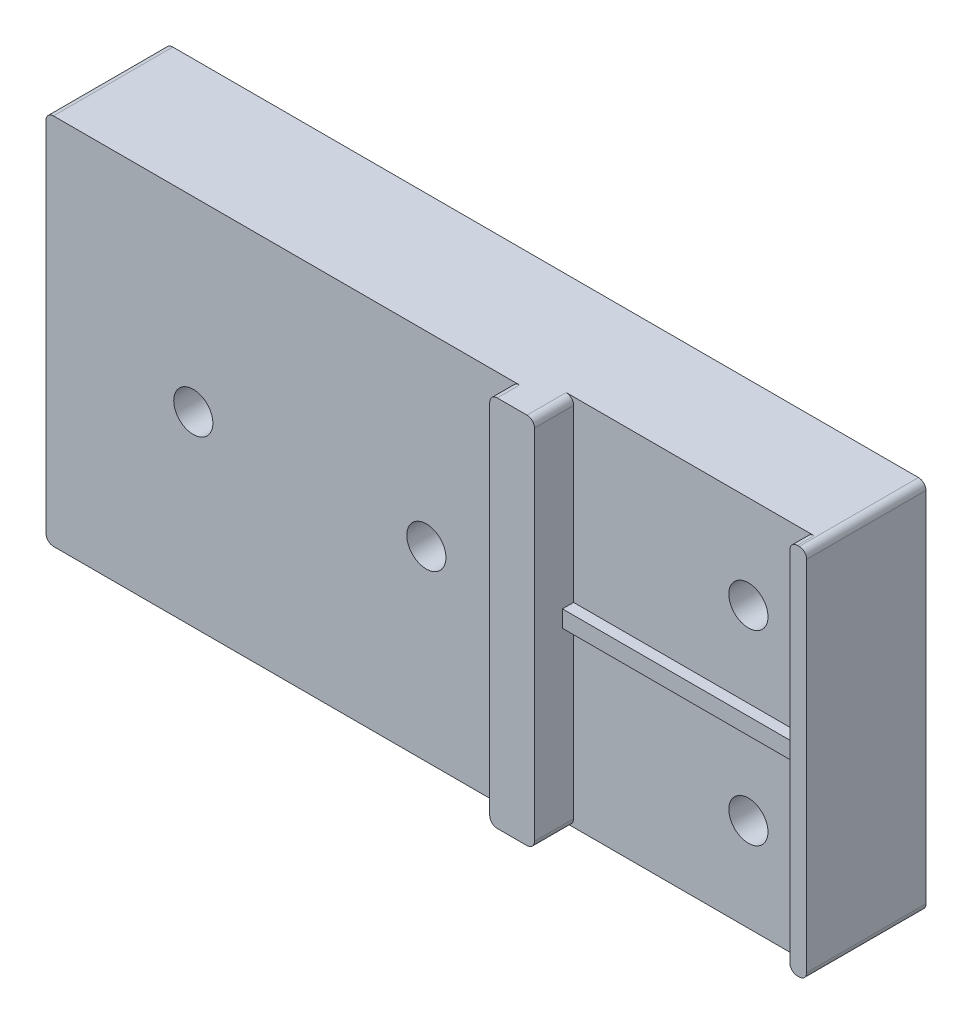
ISO-10303-21;
HEADER;
FILE_DESCRIPTION(('STEP AP214'),'2;1');
FILE_NAME('part.step','',(''),(''),'','','');
FILE_SCHEMA(('AUTOMOTIVE_DESIGN { 1 0 10303 214 1 1 1 1 }'));
ENDSEC;
DATA;
#1=APPLICATION_CONTEXT('core data for automotive mechanical design processes');
#2=APPLICATION_PROTOCOL_DEFINITION('international standard','automotive_design',2000,#1);
#3=PRODUCT_CONTEXT('',#1,'mechanical');
#4=PRODUCT('Part','Part','',(#3));
#5=PRODUCT_RELATED_PRODUCT_CATEGORY('part','',(#4));
#6=PRODUCT_DEFINITION_FORMATION('','',#4);
#7=PRODUCT_DEFINITION_CONTEXT('part definition',#1,'design');
#8=PRODUCT_DEFINITION('design','',#6,#7);
#9=PRODUCT_DEFINITION_SHAPE('','',#8);
#10=(LENGTH_UNIT() NAMED_UNIT(*) SI_UNIT(.MILLI.,.METRE.));
#11=(NAMED_UNIT(*) PLANE_ANGLE_UNIT() SI_UNIT($,.RADIAN.));
#12=(NAMED_UNIT(*) SI_UNIT($,.STERADIAN.) SOLID_ANGLE_UNIT());
#13=UNCERTAINTY_MEASURE_WITH_UNIT(LENGTH_MEASURE(1.E-05),#10,'distance_accuracy_value','');
#14=(GEOMETRIC_REPRESENTATION_CONTEXT(3) GLOBAL_UNCERTAINTY_ASSIGNED_CONTEXT((#13)) GLOBAL_UNIT_ASSIGNED_CONTEXT((#10,
#11,#12)) REPRESENTATION_CONTEXT('',''));
#15=CARTESIAN_POINT('',(0.,0.,0.));
#16=DIRECTION('',(0.,0.,1.));
#17=DIRECTION('',(1.,0.,0.));
#18=AXIS2_PLACEMENT_3D('',#15,#16,#17);
#19=CARTESIAN_POINT('',(14.,-40.,15.2));
#20=DIRECTION('',(-1.,0.,0.));
#21=DIRECTION('',(0.,0.,1.));
#22=AXIS2_PLACEMENT_3D('',#19,#20,#21);
#23=PLANE('',#22);
#24=DIRECTION('',(0.,1.,0.));
#25=VECTOR('',#24,1.);
#26=CARTESIAN_POINT('',(14.,-40.,15.2));
#27=LINE('',#26,#25);
#28=CARTESIAN_POINT('',(14.,-39.2,15.2));
#29=VERTEX_POINT('',#28);
#30=CARTESIAN_POINT('',(14.,-0.800000000000002,15.2));
#31=VERTEX_POINT('',#30);
#32=EDGE_CURVE('E314',#29,#31,#27,.T.);
#33=ORIENTED_EDGE('',*,*,#32,.F.);
#34=DIRECTION('',(0.,0.,1.));
#35=VECTOR('',#34,1.);
#36=CARTESIAN_POINT('',(14.,-39.2,11.));
#37=LINE('',#36,#35);
#38=CARTESIAN_POINT('',(14.,-39.2,11.));
#39=VERTEX_POINT('',#38);
#40=EDGE_CURVE('E373',#29,#39,#37,.F.);
#41=ORIENTED_EDGE('',*,*,#40,.T.);
#42=DIRECTION('',(0.,1.,0.));
#43=VECTOR('',#42,1.);
#44=CARTESIAN_POINT('',(14.,-40.,11.));
#45=LINE('',#44,#43);
#46=CARTESIAN_POINT('',(14.,-20.9,11.));
#47=VERTEX_POINT('',#46);
#48=EDGE_CURVE('E294',#39,#47,#45,.T.);
#49=ORIENTED_EDGE('',*,*,#48,.T.);
#50=DIRECTION('',(0.,0.,-1.));
#51=VECTOR('',#50,1.);
#52=CARTESIAN_POINT('',(14.,-20.9,12.2));
#53=LINE('',#52,#51);
#54=CARTESIAN_POINT('',(14.,-20.9,12.2));
#55=VERTEX_POINT('',#54);
#56=EDGE_CURVE('E218',#55,#47,#53,.T.);
#57=ORIENTED_EDGE('',*,*,#56,.F.);
#58=DIRECTION('',(0.,-1.,0.));
#59=VECTOR('',#58,1.);
#60=CARTESIAN_POINT('',(14.,-19.1,12.2));
#61=LINE('',#60,#59);
#62=CARTESIAN_POINT('',(14.,-19.1,12.2));
#63=VERTEX_POINT('',#62);
#64=EDGE_CURVE('E829',#63,#55,#61,.T.);
#65=ORIENTED_EDGE('',*,*,#64,.F.);
#66=DIRECTION('',(0.,0.,-1.));
#67=VECTOR('',#66,1.);
#68=CARTESIAN_POINT('',(14.,-19.1,12.2));
#69=LINE('',#68,#67);
#70=CARTESIAN_POINT('',(14.,-19.1,11.));
#71=VERTEX_POINT('',#70);
#72=EDGE_CURVE('E231',#63,#71,#69,.T.);
#73=ORIENTED_EDGE('',*,*,#72,.T.);
#74=CARTESIAN_POINT('',(14.,-0.800000000000002,11.));
#75=VERTEX_POINT('',#74);
#76=EDGE_CURVE('E282',#71,#75,#45,.T.);
#77=ORIENTED_EDGE('',*,*,#76,.T.);
#78=DIRECTION('',(0.,0.,1.));
#79=VECTOR('',#78,1.);
#80=CARTESIAN_POINT('',(14.,-0.800000000000002,15.2));
#81=LINE('',#80,#79);
#82=EDGE_CURVE('E370',#75,#31,#81,.T.);
#83=ORIENTED_EDGE('',*,*,#82,.T.);
#84=EDGE_LOOP('',(#33,#41,#49,#57,#65,#73,#77,#83));
#85=FACE_BOUND('',#84,.T.);
#86=ADVANCED_FACE('F33',(#85),#23,.F.);
#87=CARTESIAN_POINT('',(39.,-40.,11.));
#88=DIRECTION('',(1.,0.,0.));
#89=DIRECTION('',(0.,0.,-1.));
#90=AXIS2_PLACEMENT_3D('',#87,#88,#89);
#91=PLANE('',#90);
#92=DIRECTION('',(0.,1.,0.));
#93=VECTOR('',#92,1.);
#94=CARTESIAN_POINT('',(39.,-40.,12.8));
#95=LINE('',#94,#93);
#96=CARTESIAN_POINT('',(39.,-39.2,12.8));
#97=VERTEX_POINT('',#96);
#98=CARTESIAN_POINT('',(39.,-0.800000000000002,12.8));
#99=VERTEX_POINT('',#98);
#100=EDGE_CURVE('E206',#97,#99,#95,.T.);
#101=ORIENTED_EDGE('',*,*,#100,.T.);
#102=DIRECTION('',(0.,0.,-1.));
#103=VECTOR('',#102,1.);
#104=CARTESIAN_POINT('',(39.,-0.800000000000002,11.));
#105=LINE('',#104,#103);
#106=CARTESIAN_POINT('',(39.,-0.800000000000002,11.));
#107=VERTEX_POINT('',#106);
#108=EDGE_CURVE('E325',#99,#107,#105,.T.);
#109=ORIENTED_EDGE('',*,*,#108,.T.);
#110=DIRECTION('',(0.,1.,0.));
#111=VECTOR('',#110,1.);
#112=CARTESIAN_POINT('',(39.,-40.,11.));
#113=LINE('',#112,#111);
#114=CARTESIAN_POINT('',(39.,-19.1,11.));
#115=VERTEX_POINT('',#114);
#116=EDGE_CURVE('E207',#115,#107,#113,.T.);
#117=ORIENTED_EDGE('',*,*,#116,.F.);
#118=DIRECTION('',(0.,0.,-1.));
#119=VECTOR('',#118,1.);
#120=CARTESIAN_POINT('',(39.,-19.1,12.2));
#121=LINE('',#120,#119);
#122=CARTESIAN_POINT('',(39.,-19.1,12.2));
#123=VERTEX_POINT('',#122);
#124=EDGE_CURVE('E233',#123,#115,#121,.T.);
#125=ORIENTED_EDGE('',*,*,#124,.F.);
#126=DIRECTION('',(0.,1.,0.));
#127=VECTOR('',#126,1.);
#128=CARTESIAN_POINT('',(39.,-19.1,12.2));
#129=LINE('',#128,#127);
#130=CARTESIAN_POINT('',(39.,-20.9,12.2));
#131=VERTEX_POINT('',#130);
#132=EDGE_CURVE('E214',#131,#123,#129,.T.);
#133=ORIENTED_EDGE('',*,*,#132,.F.);
#134=DIRECTION('',(0.,0.,-1.));
#135=VECTOR('',#134,1.);
#136=CARTESIAN_POINT('',(39.,-20.9,12.2));
#137=LINE('',#136,#135);
#138=CARTESIAN_POINT('',(39.,-20.9,11.));
#139=VERTEX_POINT('',#138);
#140=EDGE_CURVE('E210',#131,#139,#137,.T.);
#141=ORIENTED_EDGE('',*,*,#140,.T.);
#142=CARTESIAN_POINT('',(39.,-39.2,11.));
#143=VERTEX_POINT('',#142);
#144=EDGE_CURVE('E195',#143,#139,#113,.T.);
#145=ORIENTED_EDGE('',*,*,#144,.F.);
#146=DIRECTION('',(0.,0.,-1.));
#147=VECTOR('',#146,1.);
#148=CARTESIAN_POINT('',(39.,-39.2,12.8));
#149=LINE('',#148,#147);
#150=EDGE_CURVE('E323',#143,#97,#149,.F.);
#151=ORIENTED_EDGE('',*,*,#150,.T.);
#152=EDGE_LOOP('',(#101,#109,#117,#125,#133,#141,#145,#151));
#153=FACE_BOUND('',#152,.T.);
#154=ADVANCED_FACE('F212',(#153),#91,.F.);
#155=CARTESIAN_POINT('',(14.,-40.,11.));
#156=DIRECTION('',(0.,0.,-1.));
#157=DIRECTION('',(-1.,0.,0.));
#158=AXIS2_PLACEMENT_3D('',#155,#156,#157);
#159=PLANE('',#158);
#160=CARTESIAN_POINT('',(32.75,-10.,11.));
#161=DIRECTION('',(0.,0.,1.));
#162=DIRECTION('',(1.,0.,0.));
#163=AXIS2_PLACEMENT_3D('',#160,#161,#162);
#164=CIRCLE('',#163,2.1);
#165=CARTESIAN_POINT('',(34.85,-10.,11.));
#166=VERTEX_POINT('',#165);
#167=EDGE_CURVE('E249',#166,#166,#164,.T.);
#168=ORIENTED_EDGE('',*,*,#167,.F.);
#169=EDGE_LOOP('',(#168));
#170=FACE_BOUND('',#169,.T.);
#171=DIRECTION('',(-1.,0.,0.));
#172=VECTOR('',#171,1.);
#173=CARTESIAN_POINT('',(14.,-19.1,11.));
#174=LINE('',#173,#172);
#175=EDGE_CURVE('E222',#115,#71,#174,.T.);
#176=ORIENTED_EDGE('',*,*,#175,.F.);
#177=ORIENTED_EDGE('',*,*,#116,.T.);
#178=CARTESIAN_POINT('',(39.8,-0.800000000000002,11.));
#179=DIRECTION('',(0.,0.,-1.));
#180=DIRECTION('',(-1.,0.,0.));
#181=AXIS2_PLACEMENT_3D('',#178,#179,#180);
#182=CIRCLE('',#181,0.8);
#183=CARTESIAN_POINT('',(39.8,0.,11.));
#184=VERTEX_POINT('',#183);
#185=EDGE_CURVE('E400',#107,#184,#182,.T.);
#186=ORIENTED_EDGE('',*,*,#185,.T.);
#187=DIRECTION('',(-1.,0.,0.));
#188=VECTOR('',#187,1.);
#189=CARTESIAN_POINT('',(14.,0.,11.));
#190=LINE('',#189,#188);
#191=CARTESIAN_POINT('',(13.2,0.,11.));
#192=VERTEX_POINT('',#191);
#193=EDGE_CURVE('E271',#184,#192,#190,.T.);
#194=ORIENTED_EDGE('',*,*,#193,.T.);
#195=CARTESIAN_POINT('',(13.2,-0.800000000000002,11.));
#196=DIRECTION('',(0.,0.,-1.));
#197=DIRECTION('',(-1.,0.,0.));
#198=AXIS2_PLACEMENT_3D('',#195,#196,#197);
#199=CIRCLE('',#198,0.8);
#200=EDGE_CURVE('E11',#192,#75,#199,.T.);
#201=ORIENTED_EDGE('',*,*,#200,.T.);
#202=ORIENTED_EDGE('',*,*,#76,.F.);
#203=EDGE_LOOP('',(#176,#177,#186,#194,#201,#202));
#204=FACE_BOUND('',#203,.T.);
#205=ADVANCED_FACE('F437',(#170,#204),#159,.F.);
#206=CARTESIAN_POINT('',(32.75,-30.,11.));
#207=DIRECTION('',(0.,0.,1.));
#208=DIRECTION('',(1.,0.,0.));
#209=AXIS2_PLACEMENT_3D('',#206,#207,#208);
#210=CIRCLE('',#209,2.1);
#211=CARTESIAN_POINT('',(34.85,-30.,11.));
#212=VERTEX_POINT('',#211);
#213=EDGE_CURVE('E240',#212,#212,#210,.T.);
#214=ORIENTED_EDGE('',*,*,#213,.F.);
#215=EDGE_LOOP('',(#214));
#216=FACE_BOUND('',#215,.T.);
#217=DIRECTION('',(1.,0.,0.));
#218=VECTOR('',#217,1.);
#219=CARTESIAN_POINT('',(14.,-20.9,11.));
#220=LINE('',#219,#218);
#221=EDGE_CURVE('E200',#47,#139,#220,.T.);
#222=ORIENTED_EDGE('',*,*,#221,.F.);
#223=ORIENTED_EDGE('',*,*,#48,.F.);
#224=CARTESIAN_POINT('',(13.2,-39.2,11.));
#225=DIRECTION('',(0.,0.,-1.));
#226=DIRECTION('',(-1.,0.,0.));
#227=AXIS2_PLACEMENT_3D('',#224,#225,#226);
#228=CIRCLE('',#227,0.8);
#229=CARTESIAN_POINT('',(13.2,-40.,11.));
#230=VERTEX_POINT('',#229);
#231=EDGE_CURVE('E404',#39,#230,#228,.T.);
#232=ORIENTED_EDGE('',*,*,#231,.T.);
#233=DIRECTION('',(-1.,0.,0.));
#234=VECTOR('',#233,1.);
#235=CARTESIAN_POINT('',(14.,-40.,11.));
#236=LINE('',#235,#234);
#237=CARTESIAN_POINT('',(39.8,-40.,11.));
#238=VERTEX_POINT('',#237);
#239=EDGE_CURVE('E280',#238,#230,#236,.T.);
#240=ORIENTED_EDGE('',*,*,#239,.F.);
#241=CARTESIAN_POINT('',(39.8,-39.2,11.));
#242=DIRECTION('',(0.,0.,-1.));
#243=DIRECTION('',(-1.,0.,0.));
#244=AXIS2_PLACEMENT_3D('',#241,#242,#243);
#245=CIRCLE('',#244,0.8);
#246=EDGE_CURVE('E203',#238,#143,#245,.T.);
#247=ORIENTED_EDGE('',*,*,#246,.T.);
#248=ORIENTED_EDGE('',*,*,#144,.T.);
#249=EDGE_LOOP('',(#222,#223,#232,#240,#247,#248));
#250=FACE_BOUND('',#249,.T.);
#251=ADVANCED_FACE('F197',(#216,#250),#159,.F.);
#252=CARTESIAN_POINT('',(32.75,-30.,-0.00100000000000794));
#253=DIRECTION('',(0.,0.,1.));
#254=DIRECTION('',(1.,0.,0.));
#255=AXIS2_PLACEMENT_3D('',#252,#253,#254);
#256=CYLINDRICAL_SURFACE('',#255,2.1);
#257=ORIENTED_EDGE('',*,*,#213,.T.);
#258=EDGE_LOOP('',(#257));
#259=FACE_BOUND('',#258,.T.);
#260=CARTESIAN_POINT('',(32.75,-30.,5.1));
#261=DIRECTION('',(0.,0.,-1.));
#262=DIRECTION('',(-1.,0.,0.));
#263=AXIS2_PLACEMENT_3D('',#260,#261,#262);
#264=CIRCLE('',#263,2.1);
#265=CARTESIAN_POINT('',(30.65,-30.,5.1));
#266=VERTEX_POINT('',#265);
#267=EDGE_CURVE('E320',#266,#266,#264,.F.);
#268=ORIENTED_EDGE('',*,*,#267,.F.);
#269=EDGE_LOOP('',(#268));
#270=FACE_BOUND('',#269,.T.);
#271=ADVANCED_FACE('F659',(#259,#270),#256,.F.);
#272=CARTESIAN_POINT('',(32.75,-10.,-0.00100000000000794));
#273=DIRECTION('',(0.,0.,1.));
#274=DIRECTION('',(1.,0.,0.));
#275=AXIS2_PLACEMENT_3D('',#272,#273,#274);
#276=CYLINDRICAL_SURFACE('',#275,2.1);
#277=ORIENTED_EDGE('',*,*,#167,.T.);
#278=EDGE_LOOP('',(#277));
#279=FACE_BOUND('',#278,.T.);
#280=CARTESIAN_POINT('',(32.75,-10.,5.1));
#281=DIRECTION('',(0.,0.,-1.));
#282=DIRECTION('',(-1.,0.,0.));
#283=AXIS2_PLACEMENT_3D('',#280,#281,#282);
#284=CIRCLE('',#283,2.1);
#285=CARTESIAN_POINT('',(30.65,-10.,5.1));
#286=VERTEX_POINT('',#285);
#287=EDGE_CURVE('E317',#286,#286,#284,.F.);
#288=ORIENTED_EDGE('',*,*,#287,.F.);
#289=EDGE_LOOP('',(#288));
#290=FACE_BOUND('',#289,.T.);
#291=ADVANCED_FACE('F491',(#279,#290),#276,.F.);
#292=CARTESIAN_POINT('',(9.2,-40.,15.2));
#293=DIRECTION('',(0.,0.,-1.));
#294=DIRECTION('',(-1.,0.,0.));
#295=AXIS2_PLACEMENT_3D('',#292,#293,#294);
#296=PLANE('',#295);
#297=DIRECTION('',(-1.,0.,0.));
#298=VECTOR('',#297,1.);
#299=CARTESIAN_POINT('',(9.2,-40.,15.2));
#300=LINE('',#299,#298);
#301=CARTESIAN_POINT('',(13.2,-40.,15.2));
#302=VERTEX_POINT('',#301);
#303=CARTESIAN_POINT('',(10.,-40.,15.2));
#304=VERTEX_POINT('',#303);
#305=EDGE_CURVE('E267',#302,#304,#300,.T.);
#306=ORIENTED_EDGE('',*,*,#305,.F.);
#307=CARTESIAN_POINT('',(13.2,-39.2,15.2));
#308=DIRECTION('',(0.,0.,-1.));
#309=DIRECTION('',(-1.,0.,0.));
#310=AXIS2_PLACEMENT_3D('',#307,#308,#309);
#311=CIRCLE('',#310,0.8);
#312=EDGE_CURVE('E368',#302,#29,#311,.F.);
#313=ORIENTED_EDGE('',*,*,#312,.T.);
#314=ORIENTED_EDGE('',*,*,#32,.T.);
#315=CARTESIAN_POINT('',(13.2,-0.800000000000002,15.2));
#316=DIRECTION('',(0.,0.,-1.));
#317=DIRECTION('',(-1.,0.,0.));
#318=AXIS2_PLACEMENT_3D('',#315,#316,#317);
#319=CIRCLE('',#318,0.8);
#320=CARTESIAN_POINT('',(13.2,0.,15.2));
#321=VERTEX_POINT('',#320);
#322=EDGE_CURVE('E362',#31,#321,#319,.F.);
#323=ORIENTED_EDGE('',*,*,#322,.T.);
#324=DIRECTION('',(-1.,0.,0.));
#325=VECTOR('',#324,1.);
#326=CARTESIAN_POINT('',(9.2,0.,15.2));
#327=LINE('',#326,#325);
#328=CARTESIAN_POINT('',(10.,0.,15.2));
#329=VERTEX_POINT('',#328);
#330=EDGE_CURVE('E262',#321,#329,#327,.T.);
#331=ORIENTED_EDGE('',*,*,#330,.T.);
#332=CARTESIAN_POINT('',(10.,-0.800000000000002,15.2));
#333=DIRECTION('',(0.,0.,-1.));
#334=DIRECTION('',(-1.,0.,0.));
#335=AXIS2_PLACEMENT_3D('',#332,#333,#334);
#336=CIRCLE('',#335,0.8);
#337=CARTESIAN_POINT('',(9.2,-0.800000000000002,15.2));
#338=VERTEX_POINT('',#337);
#339=EDGE_CURVE('E364',#329,#338,#336,.F.);
#340=ORIENTED_EDGE('',*,*,#339,.T.);
#341=DIRECTION('',(0.,1.,0.));
#342=VECTOR('',#341,1.);
#343=CARTESIAN_POINT('',(9.2,-40.,15.2));
#344=LINE('',#343,#342);
#345=CARTESIAN_POINT('',(9.2,-39.2,15.2));
#346=VERTEX_POINT('',#345);
#347=EDGE_CURVE('E311',#346,#338,#344,.T.);
#348=ORIENTED_EDGE('',*,*,#347,.F.);
#349=CARTESIAN_POINT('',(10.,-39.2,15.2));
#350=DIRECTION('',(0.,0.,-1.));
#351=DIRECTION('',(-1.,0.,0.));
#352=AXIS2_PLACEMENT_3D('',#349,#350,#351);
#353=CIRCLE('',#352,0.8);
#354=EDGE_CURVE('E366',#346,#304,#353,.F.);
#355=ORIENTED_EDGE('',*,*,#354,.T.);
#356=EDGE_LOOP('',(#306,#313,#314,#323,#331,#340,#348,#355));
#357=FACE_BOUND('',#356,.T.);
#358=ADVANCED_FACE('F424',(#357),#296,.F.);
#359=CARTESIAN_POINT('',(9.2,-40.,12.8));
#360=DIRECTION('',(1.,0.,0.));
#361=DIRECTION('',(0.,0.,-1.));
#362=AXIS2_PLACEMENT_3D('',#359,#360,#361);
#363=PLANE('',#362);
#364=DIRECTION('',(0.,1.,0.));
#365=VECTOR('',#364,1.);
#366=CARTESIAN_POINT('',(9.2,-40.,12.8));
#367=LINE('',#366,#365);
#368=CARTESIAN_POINT('',(9.2,-39.2,12.8));
#369=VERTEX_POINT('',#368);
#370=CARTESIAN_POINT('',(9.2,-0.800000000000002,12.8));
#371=VERTEX_POINT('',#370);
#372=EDGE_CURVE('E308',#369,#371,#367,.T.);
#373=ORIENTED_EDGE('',*,*,#372,.F.);
#374=DIRECTION('',(0.,0.,-1.));
#375=VECTOR('',#374,1.);
#376=CARTESIAN_POINT('',(9.2,-39.2,15.2));
#377=LINE('',#376,#375);
#378=EDGE_CURVE('E378',#369,#346,#377,.F.);
#379=ORIENTED_EDGE('',*,*,#378,.T.);
#380=ORIENTED_EDGE('',*,*,#347,.T.);
#381=DIRECTION('',(0.,0.,-1.));
#382=VECTOR('',#381,1.);
#383=CARTESIAN_POINT('',(9.2,-0.800000000000002,12.8));
#384=LINE('',#383,#382);
#385=EDGE_CURVE('E375',#338,#371,#384,.T.);
#386=ORIENTED_EDGE('',*,*,#385,.T.);
#387=EDGE_LOOP('',(#373,#379,#380,#386));
#388=FACE_BOUND('',#387,.T.);
#389=ADVANCED_FACE('F481',(#388),#363,.F.);
#390=CARTESIAN_POINT('',(-40.8,-40.,12.8));
#391=DIRECTION('',(0.,0.,-1.));
#392=DIRECTION('',(-1.,0.,0.));
#393=AXIS2_PLACEMENT_3D('',#390,#391,#392);
#394=PLANE('',#393);
#395=CARTESIAN_POINT('',(-25.,-20.,12.8));
#396=DIRECTION('',(0.,0.,-1.));
#397=DIRECTION('',(-1.,0.,0.));
#398=AXIS2_PLACEMENT_3D('',#395,#396,#397);
#399=CIRCLE('',#398,2.1);
#400=CARTESIAN_POINT('',(-27.1,-20.,12.8));
#401=VERTEX_POINT('',#400);
#402=EDGE_CURVE('E258',#401,#401,#399,.F.);
#403=ORIENTED_EDGE('',*,*,#402,.F.);
#404=EDGE_LOOP('',(#403));
#405=FACE_BOUND('',#404,.T.);
#406=CARTESIAN_POINT('',(0.,-20.,12.8));
#407=DIRECTION('',(0.,0.,-1.));
#408=DIRECTION('',(-1.,0.,0.));
#409=AXIS2_PLACEMENT_3D('',#406,#407,#408);
#410=CIRCLE('',#409,2.1);
#411=CARTESIAN_POINT('',(-2.1,-20.,12.8));
#412=VERTEX_POINT('',#411);
#413=EDGE_CURVE('E259',#412,#412,#410,.F.);
#414=ORIENTED_EDGE('',*,*,#413,.F.);
#415=EDGE_LOOP('',(#414));
#416=FACE_BOUND('',#415,.T.);
#417=DIRECTION('',(-1.,0.,0.));
#418=VECTOR('',#417,1.);
#419=CARTESIAN_POINT('',(-40.8,0.,12.8));
#420=LINE('',#419,#418);
#421=CARTESIAN_POINT('',(10.,0.,12.8));
#422=VERTEX_POINT('',#421);
#423=CARTESIAN_POINT('',(-40.,0.,12.8));
#424=VERTEX_POINT('',#423);
#425=EDGE_CURVE('E285',#422,#424,#420,.T.);
#426=ORIENTED_EDGE('',*,*,#425,.T.);
#427=CARTESIAN_POINT('',(-40.,-0.800000000000002,12.8));
#428=DIRECTION('',(0.,0.,-1.));
#429=DIRECTION('',(-1.,0.,0.));
#430=AXIS2_PLACEMENT_3D('',#427,#428,#429);
#431=CIRCLE('',#430,0.8);
#432=CARTESIAN_POINT('',(-40.8,-0.800000000000002,12.8));
#433=VERTEX_POINT('',#432);
#434=EDGE_CURVE('E394',#424,#433,#431,.F.);
#435=ORIENTED_EDGE('',*,*,#434,.T.);
#436=DIRECTION('',(0.,1.,0.));
#437=VECTOR('',#436,1.);
#438=CARTESIAN_POINT('',(-40.8,-40.,12.8));
#439=LINE('',#438,#437);
#440=CARTESIAN_POINT('',(-40.8,-39.2,12.8));
#441=VERTEX_POINT('',#440);
#442=EDGE_CURVE('E305',#441,#433,#439,.T.);
#443=ORIENTED_EDGE('',*,*,#442,.F.);
#444=CARTESIAN_POINT('',(-40.,-39.2,12.8));
#445=DIRECTION('',(0.,0.,-1.));
#446=DIRECTION('',(-1.,0.,0.));
#447=AXIS2_PLACEMENT_3D('',#444,#445,#446);
#448=CIRCLE('',#447,0.8);
#449=CARTESIAN_POINT('',(-40.,-40.,12.8));
#450=VERTEX_POINT('',#449);
#451=EDGE_CURVE('E392',#441,#450,#448,.F.);
#452=ORIENTED_EDGE('',*,*,#451,.T.);
#453=DIRECTION('',(-1.,0.,0.));
#454=VECTOR('',#453,1.);
#455=CARTESIAN_POINT('',(-40.8,-40.,12.8));
#456=LINE('',#455,#454);
#457=CARTESIAN_POINT('',(10.,-40.,12.8));
#458=VERTEX_POINT('',#457);
#459=EDGE_CURVE('E270',#458,#450,#456,.T.);
#460=ORIENTED_EDGE('',*,*,#459,.F.);
#461=CARTESIAN_POINT('',(10.,-39.2,12.8));
#462=DIRECTION('',(0.,0.,-1.));
#463=DIRECTION('',(-1.,0.,0.));
#464=AXIS2_PLACEMENT_3D('',#461,#462,#463);
#465=CIRCLE('',#464,0.8);
#466=EDGE_CURVE('E407',#458,#369,#465,.T.);
#467=ORIENTED_EDGE('',*,*,#466,.T.);
#468=ORIENTED_EDGE('',*,*,#372,.T.);
#469=CARTESIAN_POINT('',(10.,-0.800000000000002,12.8));
#470=DIRECTION('',(0.,0.,-1.));
#471=DIRECTION('',(-1.,0.,0.));
#472=AXIS2_PLACEMENT_3D('',#469,#470,#471);
#473=CIRCLE('',#472,0.8);
#474=EDGE_CURVE('E41',#371,#422,#473,.T.);
#475=ORIENTED_EDGE('',*,*,#474,.T.);
#476=EDGE_LOOP('',(#426,#435,#443,#452,#460,#467,#468,#475));
#477=FACE_BOUND('',#476,.T.);
#478=ADVANCED_FACE('F411',(#405,#416,#477),#394,.F.);
#479=CARTESIAN_POINT('',(-40.8,-40.,0.));
#480=DIRECTION('',(1.,0.,0.));
#481=DIRECTION('',(0.,0.,-1.));
#482=AXIS2_PLACEMENT_3D('',#479,#480,#481);
#483=PLANE('',#482);
#484=ORIENTED_EDGE('',*,*,#442,.T.);
#485=DIRECTION('',(0.,0.,-1.));
#486=VECTOR('',#485,1.);
#487=CARTESIAN_POINT('',(-40.8,-0.800000000000002,0.));
#488=LINE('',#487,#486);
#489=CARTESIAN_POINT('',(-40.8,-0.800000000000002,0.));
#490=VERTEX_POINT('',#489);
#491=EDGE_CURVE('E382',#433,#490,#488,.T.);
#492=ORIENTED_EDGE('',*,*,#491,.T.);
#493=DIRECTION('',(0.,1.,0.));
#494=VECTOR('',#493,1.);
#495=CARTESIAN_POINT('',(-40.8,-40.,0.));
#496=LINE('',#495,#494);
#497=CARTESIAN_POINT('',(-40.8,-39.2,0.));
#498=VERTEX_POINT('',#497);
#499=EDGE_CURVE('E302',#498,#490,#496,.T.);
#500=ORIENTED_EDGE('',*,*,#499,.F.);
#501=DIRECTION('',(0.,0.,-1.));
#502=VECTOR('',#501,1.);
#503=CARTESIAN_POINT('',(-40.8,-39.2,12.8));
#504=LINE('',#503,#502);
#505=EDGE_CURVE('E380',#498,#441,#504,.F.);
#506=ORIENTED_EDGE('',*,*,#505,.T.);
#507=EDGE_LOOP('',(#484,#492,#500,#506));
#508=FACE_BOUND('',#507,.T.);
#509=ADVANCED_FACE('F488',(#508),#483,.F.);
#510=CARTESIAN_POINT('',(40.8,-40.,0.));
#511=DIRECTION('',(0.,0.,1.));
#512=DIRECTION('',(1.,0.,0.));
#513=AXIS2_PLACEMENT_3D('',#510,#511,#512);
#514=PLANE('',#513);
#515=CARTESIAN_POINT('',(32.75,-10.,0.));
#516=DIRECTION('',(0.,0.,-1.));
#517=DIRECTION('',(-1.,0.,0.));
#518=AXIS2_PLACEMENT_3D('',#515,#516,#517);
#519=CIRCLE('',#518,4.75);
#520=CARTESIAN_POINT('',(28.,-10.,0.));
#521=VERTEX_POINT('',#520);
#522=EDGE_CURVE('E241',#521,#521,#519,.T.);
#523=ORIENTED_EDGE('',*,*,#522,.F.);
#524=EDGE_LOOP('',(#523));
#525=FACE_BOUND('',#524,.T.);
#526=CARTESIAN_POINT('',(32.75,-30.,0.));
#527=DIRECTION('',(0.,0.,-1.));
#528=DIRECTION('',(-1.,0.,0.));
#529=AXIS2_PLACEMENT_3D('',#526,#527,#528);
#530=CIRCLE('',#529,4.75);
#531=CARTESIAN_POINT('',(28.,-30.,0.));
#532=VERTEX_POINT('',#531);
#533=EDGE_CURVE('E236',#532,#532,#530,.T.);
#534=ORIENTED_EDGE('',*,*,#533,.F.);
#535=EDGE_LOOP('',(#534));
#536=FACE_BOUND('',#535,.T.);
#537=CARTESIAN_POINT('',(-25.,-20.,0.));
#538=DIRECTION('',(0.,0.,-1.));
#539=DIRECTION('',(-1.,0.,0.));
#540=AXIS2_PLACEMENT_3D('',#537,#538,#539);
#541=CIRCLE('',#540,2.1);
#542=CARTESIAN_POINT('',(-27.1,-20.,0.));
#543=VERTEX_POINT('',#542);
#544=EDGE_CURVE('E255',#543,#543,#541,.T.);
#545=ORIENTED_EDGE('',*,*,#544,.F.);
#546=EDGE_LOOP('',(#545));
#547=FACE_BOUND('',#546,.T.);
#548=CARTESIAN_POINT('',(0.,-20.,0.));
#549=DIRECTION('',(0.,0.,-1.));
#550=DIRECTION('',(-1.,0.,0.));
#551=AXIS2_PLACEMENT_3D('',#548,#549,#550);
#552=CIRCLE('',#551,2.1);
#553=CARTESIAN_POINT('',(-2.1,-20.,0.));
#554=VERTEX_POINT('',#553);
#555=EDGE_CURVE('E252',#554,#554,#552,.T.);
#556=ORIENTED_EDGE('',*,*,#555,.F.);
#557=EDGE_LOOP('',(#556));
#558=FACE_BOUND('',#557,.T.);
#559=ORIENTED_EDGE('',*,*,#499,.T.);
#560=CARTESIAN_POINT('',(-40.,-0.800000000000002,0.));
#561=DIRECTION('',(0.,0.,1.));
#562=DIRECTION('',(1.,0.,0.));
#563=AXIS2_PLACEMENT_3D('',#560,#561,#562);
#564=CIRCLE('',#563,0.8);
#565=CARTESIAN_POINT('',(-40.,0.,0.));
#566=VERTEX_POINT('',#565);
#567=EDGE_CURVE('E390',#490,#566,#564,.F.);
#568=ORIENTED_EDGE('',*,*,#567,.T.);
#569=DIRECTION('',(1.,0.,0.));
#570=VECTOR('',#569,1.);
#571=CARTESIAN_POINT('',(40.8,0.,0.));
#572=LINE('',#571,#570);
#573=CARTESIAN_POINT('',(40.,0.,0.));
#574=VERTEX_POINT('',#573);
#575=EDGE_CURVE('E288',#566,#574,#572,.T.);
#576=ORIENTED_EDGE('',*,*,#575,.T.);
#577=CARTESIAN_POINT('',(40.,-0.800000000000002,0.));
#578=DIRECTION('',(0.,0.,1.));
#579=DIRECTION('',(1.,0.,0.));
#580=AXIS2_PLACEMENT_3D('',#577,#578,#579);
#581=CIRCLE('',#580,0.8);
#582=CARTESIAN_POINT('',(40.8,-0.800000000000002,0.));
#583=VERTEX_POINT('',#582);
#584=EDGE_CURVE('E48',#574,#583,#581,.F.);
#585=ORIENTED_EDGE('',*,*,#584,.T.);
#586=DIRECTION('',(0.,1.,0.));
#587=VECTOR('',#586,1.);
#588=CARTESIAN_POINT('',(40.8,-40.,0.));
#589=LINE('',#588,#587);
#590=CARTESIAN_POINT('',(40.8,-39.2,0.));
#591=VERTEX_POINT('',#590);
#592=EDGE_CURVE('E300',#591,#583,#589,.T.);
#593=ORIENTED_EDGE('',*,*,#592,.F.);
#594=CARTESIAN_POINT('',(40.,-39.2,0.));
#595=DIRECTION('',(0.,0.,1.));
#596=DIRECTION('',(1.,0.,0.));
#597=AXIS2_PLACEMENT_3D('',#594,#595,#596);
#598=CIRCLE('',#597,0.8);
#599=CARTESIAN_POINT('',(40.,-40.,0.));
#600=VERTEX_POINT('',#599);
#601=EDGE_CURVE('E385',#591,#600,#598,.F.);
#602=ORIENTED_EDGE('',*,*,#601,.T.);
#603=DIRECTION('',(1.,0.,0.));
#604=VECTOR('',#603,1.);
#605=CARTESIAN_POINT('',(40.8,-40.,0.));
#606=LINE('',#605,#604);
#607=CARTESIAN_POINT('',(-40.,-40.,0.));
#608=VERTEX_POINT('',#607);
#609=EDGE_CURVE('E274',#608,#600,#606,.T.);
#610=ORIENTED_EDGE('',*,*,#609,.F.);
#611=CARTESIAN_POINT('',(-40.,-39.2,0.));
#612=DIRECTION('',(0.,0.,1.));
#613=DIRECTION('',(1.,0.,0.));
#614=AXIS2_PLACEMENT_3D('',#611,#612,#613);
#615=CIRCLE('',#614,0.8);
#616=EDGE_CURVE('E388',#608,#498,#615,.F.);
#617=ORIENTED_EDGE('',*,*,#616,.T.);
#618=EDGE_LOOP('',(#559,#568,#576,#585,#593,#602,#610,#617));
#619=FACE_BOUND('',#618,.T.);
#620=ADVANCED_FACE('F459',(#525,#536,#547,#558,#619),#514,.F.);
#621=CARTESIAN_POINT('',(40.8,-40.,12.8));
#622=DIRECTION('',(-1.,0.,0.));
#623=DIRECTION('',(0.,0.,1.));
#624=AXIS2_PLACEMENT_3D('',#621,#622,#623);
#625=PLANE('',#624);
#626=ORIENTED_EDGE('',*,*,#592,.T.);
#627=DIRECTION('',(0.,0.,1.));
#628=VECTOR('',#627,1.);
#629=CARTESIAN_POINT('',(40.8,-0.800000000000002,12.8));
#630=LINE('',#629,#628);
#631=CARTESIAN_POINT('',(40.8,-0.800000000000002,12.8));
#632=VERTEX_POINT('',#631);
#633=EDGE_CURVE('E397',#583,#632,#630,.T.);
#634=ORIENTED_EDGE('',*,*,#633,.T.);
#635=DIRECTION('',(0.,1.,0.));
#636=VECTOR('',#635,1.);
#637=CARTESIAN_POINT('',(40.8,-40.,12.8));
#638=LINE('',#637,#636);
#639=CARTESIAN_POINT('',(40.8,-39.2,12.8));
#640=VERTEX_POINT('',#639);
#641=EDGE_CURVE('E297',#640,#632,#638,.T.);
#642=ORIENTED_EDGE('',*,*,#641,.F.);
#643=DIRECTION('',(0.,0.,1.));
#644=VECTOR('',#643,1.);
#645=CARTESIAN_POINT('',(40.8,-39.2,0.));
#646=LINE('',#645,#644);
#647=EDGE_CURVE('E55',#640,#591,#646,.F.);
#648=ORIENTED_EDGE('',*,*,#647,.T.);
#649=EDGE_LOOP('',(#626,#634,#642,#648));
#650=FACE_BOUND('',#649,.T.);
#651=ADVANCED_FACE('F457',(#650),#625,.F.);
#652=CARTESIAN_POINT('',(39.,-40.,12.8));
#653=DIRECTION('',(0.,0.,-1.));
#654=DIRECTION('',(-1.,0.,0.));
#655=AXIS2_PLACEMENT_3D('',#652,#653,#654);
#656=PLANE('',#655);
#657=DIRECTION('',(-1.,0.,0.));
#658=VECTOR('',#657,1.);
#659=CARTESIAN_POINT('',(39.,0.,12.8));
#660=LINE('',#659,#658);
#661=CARTESIAN_POINT('',(40.,0.,12.8));
#662=VERTEX_POINT('',#661);
#663=CARTESIAN_POINT('',(39.8,0.,12.8));
#664=VERTEX_POINT('',#663);
#665=EDGE_CURVE('E290',#662,#664,#660,.T.);
#666=ORIENTED_EDGE('',*,*,#665,.T.);
#667=CARTESIAN_POINT('',(39.8,-0.800000000000002,12.8));
#668=DIRECTION('',(0.,0.,-1.));
#669=DIRECTION('',(-1.,0.,0.));
#670=AXIS2_PLACEMENT_3D('',#667,#668,#669);
#671=CIRCLE('',#670,0.8);
#672=EDGE_CURVE('E345',#664,#99,#671,.F.);
#673=ORIENTED_EDGE('',*,*,#672,.T.);
#674=ORIENTED_EDGE('',*,*,#100,.F.);
#675=CARTESIAN_POINT('',(39.8,-39.2,12.8));
#676=DIRECTION('',(0.,0.,-1.));
#677=DIRECTION('',(-1.,0.,0.));
#678=AXIS2_PLACEMENT_3D('',#675,#676,#677);
#679=CIRCLE('',#678,0.8);
#680=CARTESIAN_POINT('',(39.8,-40.,12.8));
#681=VERTEX_POINT('',#680);
#682=EDGE_CURVE('E343',#97,#681,#679,.F.);
#683=ORIENTED_EDGE('',*,*,#682,.T.);
#684=DIRECTION('',(-1.,0.,0.));
#685=VECTOR('',#684,1.);
#686=CARTESIAN_POINT('',(39.,-40.,12.8));
#687=LINE('',#686,#685);
#688=CARTESIAN_POINT('',(40.,-40.,12.8));
#689=VERTEX_POINT('',#688);
#690=EDGE_CURVE('E277',#689,#681,#687,.T.);
#691=ORIENTED_EDGE('',*,*,#690,.F.);
#692=CARTESIAN_POINT('',(40.,-39.2,12.8));
#693=DIRECTION('',(0.,0.,-1.));
#694=DIRECTION('',(-1.,0.,0.));
#695=AXIS2_PLACEMENT_3D('',#692,#693,#694);
#696=CIRCLE('',#695,0.8);
#697=EDGE_CURVE('E339',#689,#640,#696,.F.);
#698=ORIENTED_EDGE('',*,*,#697,.T.);
#699=ORIENTED_EDGE('',*,*,#641,.T.);
#700=CARTESIAN_POINT('',(40.,-0.800000000000002,12.8));
#701=DIRECTION('',(0.,0.,-1.));
#702=DIRECTION('',(-1.,0.,0.));
#703=AXIS2_PLACEMENT_3D('',#700,#701,#702);
#704=CIRCLE('',#703,0.8);
#705=EDGE_CURVE('E341',#632,#662,#704,.F.);
#706=ORIENTED_EDGE('',*,*,#705,.T.);
#707=EDGE_LOOP('',(#666,#673,#674,#683,#691,#698,#699,#706));
#708=FACE_BOUND('',#707,.T.);
#709=ADVANCED_FACE('F452',(#708),#656,.F.);
#710=CARTESIAN_POINT('',(0.,-40.,0.));
#711=DIRECTION('',(0.,-1.,0.));
#712=DIRECTION('',(0.,0.,-1.));
#713=AXIS2_PLACEMENT_3D('',#710,#711,#712);
#714=PLANE('',#713);
#715=ORIENTED_EDGE('',*,*,#690,.T.);
#716=DIRECTION('',(0.,0.,-1.));
#717=VECTOR('',#716,1.);
#718=CARTESIAN_POINT('',(39.8,-40.,11.));
#719=LINE('',#718,#717);
#720=EDGE_CURVE('E359',#681,#238,#719,.T.);
#721=ORIENTED_EDGE('',*,*,#720,.T.);
#722=ORIENTED_EDGE('',*,*,#239,.T.);
#723=DIRECTION('',(0.,0.,1.));
#724=VECTOR('',#723,1.);
#725=CARTESIAN_POINT('',(13.2,-40.,15.2));
#726=LINE('',#725,#724);
#727=EDGE_CURVE('E356',#230,#302,#726,.T.);
#728=ORIENTED_EDGE('',*,*,#727,.T.);
#729=ORIENTED_EDGE('',*,*,#305,.T.);
#730=DIRECTION('',(0.,0.,-1.));
#731=VECTOR('',#730,1.);
#732=CARTESIAN_POINT('',(10.,-40.,12.8));
#733=LINE('',#732,#731);
#734=EDGE_CURVE('E353',#304,#458,#733,.T.);
#735=ORIENTED_EDGE('',*,*,#734,.T.);
#736=ORIENTED_EDGE('',*,*,#459,.T.);
#737=DIRECTION('',(0.,0.,-1.));
#738=VECTOR('',#737,1.);
#739=CARTESIAN_POINT('',(-40.,-40.,0.));
#740=LINE('',#739,#738);
#741=EDGE_CURVE('E350',#450,#608,#740,.T.);
#742=ORIENTED_EDGE('',*,*,#741,.T.);
#743=ORIENTED_EDGE('',*,*,#609,.T.);
#744=DIRECTION('',(0.,0.,1.));
#745=VECTOR('',#744,1.);
#746=CARTESIAN_POINT('',(40.,-40.,12.8));
#747=LINE('',#746,#745);
#748=EDGE_CURVE('E347',#600,#689,#747,.T.);
#749=ORIENTED_EDGE('',*,*,#748,.T.);
#750=EDGE_LOOP('',(#715,#721,#722,#728,#729,#735,#736,#742,#743,#749));
#751=FACE_BOUND('',#750,.T.);
#752=ADVANCED_FACE('F465',(#751),#714,.T.);
#753=CARTESIAN_POINT('',(0.,0.,0.));
#754=DIRECTION('',(0.,-1.,0.));
#755=DIRECTION('',(0.,0.,-1.));
#756=AXIS2_PLACEMENT_3D('',#753,#754,#755);
#757=PLANE('',#756);
#758=ORIENTED_EDGE('',*,*,#193,.F.);
#759=DIRECTION('',(0.,0.,-1.));
#760=VECTOR('',#759,1.);
#761=CARTESIAN_POINT('',(39.8,0.,0.));
#762=LINE('',#761,#760);
#763=EDGE_CURVE('E337',#184,#664,#762,.F.);
#764=ORIENTED_EDGE('',*,*,#763,.T.);
#765=ORIENTED_EDGE('',*,*,#665,.F.);
#766=DIRECTION('',(0.,0.,1.));
#767=VECTOR('',#766,1.);
#768=CARTESIAN_POINT('',(40.,0.,0.));
#769=LINE('',#768,#767);
#770=EDGE_CURVE('E328',#662,#574,#769,.F.);
#771=ORIENTED_EDGE('',*,*,#770,.T.);
#772=ORIENTED_EDGE('',*,*,#575,.F.);
#773=DIRECTION('',(0.,0.,-1.));
#774=VECTOR('',#773,1.);
#775=CARTESIAN_POINT('',(-40.,0.,0.));
#776=LINE('',#775,#774);
#777=EDGE_CURVE('E330',#566,#424,#776,.F.);
#778=ORIENTED_EDGE('',*,*,#777,.T.);
#779=ORIENTED_EDGE('',*,*,#425,.F.);
#780=DIRECTION('',(0.,0.,-1.));
#781=VECTOR('',#780,1.);
#782=CARTESIAN_POINT('',(10.,0.,0.));
#783=LINE('',#782,#781);
#784=EDGE_CURVE('E335',#422,#329,#783,.F.);
#785=ORIENTED_EDGE('',*,*,#784,.T.);
#786=ORIENTED_EDGE('',*,*,#330,.F.);
#787=DIRECTION('',(0.,0.,1.));
#788=VECTOR('',#787,1.);
#789=CARTESIAN_POINT('',(13.2,0.,0.));
#790=LINE('',#789,#788);
#791=EDGE_CURVE('E332',#321,#192,#790,.F.);
#792=ORIENTED_EDGE('',*,*,#791,.T.);
#793=EDGE_LOOP('',(#758,#764,#765,#771,#772,#778,#779,#785,#786,#792));
#794=FACE_BOUND('',#793,.T.);
#795=ADVANCED_FACE('F420',(#794),#757,.F.);
#796=CARTESIAN_POINT('',(0.,-20.,18.739696961967));
#797=DIRECTION('',(0.,0.,-1.));
#798=DIRECTION('',(-1.,0.,0.));
#799=AXIS2_PLACEMENT_3D('',#796,#797,#798);
#800=CYLINDRICAL_SURFACE('',#799,2.1);
#801=ORIENTED_EDGE('',*,*,#413,.T.);
#802=EDGE_LOOP('',(#801));
#803=FACE_BOUND('',#802,.T.);
#804=ORIENTED_EDGE('',*,*,#555,.T.);
#805=EDGE_LOOP('',(#804));
#806=FACE_BOUND('',#805,.T.);
#807=ADVANCED_FACE('F589',(#803,#806),#800,.F.);
#808=CARTESIAN_POINT('',(-25.,-20.,18.739696961967));
#809=DIRECTION('',(0.,0.,-1.));
#810=DIRECTION('',(-1.,0.,0.));
#811=AXIS2_PLACEMENT_3D('',#808,#809,#810);
#812=CYLINDRICAL_SURFACE('',#811,2.1);
#813=ORIENTED_EDGE('',*,*,#402,.T.);
#814=EDGE_LOOP('',(#813));
#815=FACE_BOUND('',#814,.T.);
#816=ORIENTED_EDGE('',*,*,#544,.T.);
#817=EDGE_LOOP('',(#816));
#818=FACE_BOUND('',#817,.T.);
#819=ADVANCED_FACE('F748',(#815,#818),#812,.F.);
#820=CARTESIAN_POINT('',(32.75,-10.,4.5));
#821=DIRECTION('',(0.,0.,-1.));
#822=DIRECTION('',(-1.,0.,0.));
#823=AXIS2_PLACEMENT_3D('',#820,#821,#822);
#824=PLANE('',#823);
#825=CARTESIAN_POINT('',(32.75,-10.,4.5));
#826=DIRECTION('',(0.,0.,-1.));
#827=DIRECTION('',(-1.,0.,0.));
#828=AXIS2_PLACEMENT_3D('',#825,#826,#827);
#829=CIRCLE('',#828,4.75);
#830=CARTESIAN_POINT('',(28.,-10.,4.5));
#831=VERTEX_POINT('',#830);
#832=EDGE_CURVE('E237',#831,#831,#829,.T.);
#833=ORIENTED_EDGE('',*,*,#832,.T.);
#834=EDGE_LOOP('',(#833));
#835=FACE_BOUND('',#834,.T.);
#836=ADVANCED_FACE('F744',(#835),#824,.T.);
#837=CARTESIAN_POINT('',(32.75,-10.,4.5));
#838=DIRECTION('',(0.,0.,-1.));
#839=DIRECTION('',(-1.,0.,0.));
#840=AXIS2_PLACEMENT_3D('',#837,#838,#839);
#841=CYLINDRICAL_SURFACE('',#840,4.75);
#842=ORIENTED_EDGE('',*,*,#832,.F.);
#843=EDGE_LOOP('',(#842));
#844=FACE_BOUND('',#843,.T.);
#845=ORIENTED_EDGE('',*,*,#522,.T.);
#846=EDGE_LOOP('',(#845));
#847=FACE_BOUND('',#846,.T.);
#848=ADVANCED_FACE('F735',(#844,#847),#841,.F.);
#849=CARTESIAN_POINT('',(32.75,-30.,4.5));
#850=DIRECTION('',(0.,0.,-1.));
#851=DIRECTION('',(-1.,0.,0.));
#852=AXIS2_PLACEMENT_3D('',#849,#850,#851);
#853=PLANE('',#852);
#854=CARTESIAN_POINT('',(32.75,-30.,4.5));
#855=DIRECTION('',(0.,0.,-1.));
#856=DIRECTION('',(-1.,0.,0.));
#857=AXIS2_PLACEMENT_3D('',#854,#855,#856);
#858=CIRCLE('',#857,4.75);
#859=CARTESIAN_POINT('',(28.,-30.,4.5));
#860=VERTEX_POINT('',#859);
#861=EDGE_CURVE('E244',#860,#860,#858,.T.);
#862=ORIENTED_EDGE('',*,*,#861,.T.);
#863=EDGE_LOOP('',(#862));
#864=FACE_BOUND('',#863,.T.);
#865=ADVANCED_FACE('F731',(#864),#853,.T.);
#866=CARTESIAN_POINT('',(32.75,-30.,4.5));
#867=DIRECTION('',(0.,0.,-1.));
#868=DIRECTION('',(-1.,0.,0.));
#869=AXIS2_PLACEMENT_3D('',#866,#867,#868);
#870=CYLINDRICAL_SURFACE('',#869,4.75);
#871=ORIENTED_EDGE('',*,*,#861,.F.);
#872=EDGE_LOOP('',(#871));
#873=FACE_BOUND('',#872,.T.);
#874=ORIENTED_EDGE('',*,*,#533,.T.);
#875=EDGE_LOOP('',(#874));
#876=FACE_BOUND('',#875,.T.);
#877=ADVANCED_FACE('F723',(#873,#876),#870,.F.);
#878=CARTESIAN_POINT('',(32.75,-10.,5.1));
#879=DIRECTION('',(0.,0.,-1.));
#880=DIRECTION('',(-1.,0.,0.));
#881=AXIS2_PLACEMENT_3D('',#878,#879,#880);
#882=PLANE('',#881);
#883=ORIENTED_EDGE('',*,*,#287,.T.);
#884=EDGE_LOOP('',(#883));
#885=FACE_BOUND('',#884,.T.);
#886=ADVANCED_FACE('F713',(#885),#882,.F.);
#887=CARTESIAN_POINT('',(32.75,-30.,5.1));
#888=DIRECTION('',(0.,0.,-1.));
#889=DIRECTION('',(-1.,0.,0.));
#890=AXIS2_PLACEMENT_3D('',#887,#888,#889);
#891=PLANE('',#890);
#892=ORIENTED_EDGE('',*,*,#267,.T.);
#893=EDGE_LOOP('',(#892));
#894=FACE_BOUND('',#893,.T.);
#895=ADVANCED_FACE('F705',(#894),#891,.F.);
#896=CARTESIAN_POINT('',(14.,-19.1,12.2));
#897=DIRECTION('',(0.,-1.,0.));
#898=DIRECTION('',(0.,0.,-1.));
#899=AXIS2_PLACEMENT_3D('',#896,#897,#898);
#900=PLANE('',#899);
#901=ORIENTED_EDGE('',*,*,#175,.T.);
#902=ORIENTED_EDGE('',*,*,#72,.F.);
#903=DIRECTION('',(-1.,0.,0.));
#904=VECTOR('',#903,1.);
#905=CARTESIAN_POINT('',(14.,-19.1,12.2));
#906=LINE('',#905,#904);
#907=EDGE_CURVE('E224',#123,#63,#906,.T.);
#908=ORIENTED_EDGE('',*,*,#907,.F.);
#909=ORIENTED_EDGE('',*,*,#124,.T.);
#910=EDGE_LOOP('',(#901,#902,#908,#909));
#911=FACE_BOUND('',#910,.T.);
#912=ADVANCED_FACE('F441',(#911),#900,.F.);
#913=CARTESIAN_POINT('',(14.,-20.9,12.2));
#914=DIRECTION('',(0.,1.,0.));
#915=DIRECTION('',(0.,0.,1.));
#916=AXIS2_PLACEMENT_3D('',#913,#914,#915);
#917=PLANE('',#916);
#918=ORIENTED_EDGE('',*,*,#221,.T.);
#919=ORIENTED_EDGE('',*,*,#140,.F.);
#920=DIRECTION('',(1.,0.,0.));
#921=VECTOR('',#920,1.);
#922=CARTESIAN_POINT('',(14.,-20.9,12.2));
#923=LINE('',#922,#921);
#924=EDGE_CURVE('E219',#55,#131,#923,.T.);
#925=ORIENTED_EDGE('',*,*,#924,.F.);
#926=ORIENTED_EDGE('',*,*,#56,.T.);
#927=EDGE_LOOP('',(#918,#919,#925,#926));
#928=FACE_BOUND('',#927,.T.);
#929=ADVANCED_FACE('F221',(#928),#917,.F.);
#930=CARTESIAN_POINT('',(0.,0.,12.2));
#931=DIRECTION('',(0.,0.,1.));
#932=DIRECTION('',(1.,0.,0.));
#933=AXIS2_PLACEMENT_3D('',#930,#931,#932);
#934=PLANE('',#933);
#935=ORIENTED_EDGE('',*,*,#132,.T.);
#936=ORIENTED_EDGE('',*,*,#907,.T.);
#937=ORIENTED_EDGE('',*,*,#64,.T.);
#938=ORIENTED_EDGE('',*,*,#924,.T.);
#939=EDGE_LOOP('',(#935,#936,#937,#938));
#940=FACE_BOUND('',#939,.T.);
#941=ADVANCED_FACE('F502',(#940),#934,.T.);
#942=CARTESIAN_POINT('',(39.8,-0.800000000000002,11.));
#943=DIRECTION('',(0.,0.,-1.));
#944=DIRECTION('',(-1.,0.,0.));
#945=AXIS2_PLACEMENT_3D('',#942,#943,#944);
#946=CYLINDRICAL_SURFACE('',#945,0.8);
#947=ORIENTED_EDGE('',*,*,#672,.F.);
#948=ORIENTED_EDGE('',*,*,#763,.F.);
#949=ORIENTED_EDGE('',*,*,#185,.F.);
#950=ORIENTED_EDGE('',*,*,#108,.F.);
#951=EDGE_LOOP('',(#947,#948,#949,#950));
#952=FACE_BOUND('',#951,.T.);
#953=ADVANCED_FACE('F448',(#952),#946,.T.);
#954=CARTESIAN_POINT('',(39.8,-39.2,0.));
#955=DIRECTION('',(0.,0.,1.));
#956=DIRECTION('',(1.,0.,0.));
#957=AXIS2_PLACEMENT_3D('',#954,#955,#956);
#958=CYLINDRICAL_SURFACE('',#957,0.8);
#959=ORIENTED_EDGE('',*,*,#682,.F.);
#960=ORIENTED_EDGE('',*,*,#150,.F.);
#961=ORIENTED_EDGE('',*,*,#246,.F.);
#962=ORIENTED_EDGE('',*,*,#720,.F.);
#963=EDGE_LOOP('',(#959,#960,#961,#962));
#964=FACE_BOUND('',#963,.T.);
#965=ADVANCED_FACE('F469',(#964),#958,.T.);
#966=CARTESIAN_POINT('',(13.2,-39.2,0.));
#967=DIRECTION('',(0.,0.,-1.));
#968=DIRECTION('',(-1.,0.,0.));
#969=AXIS2_PLACEMENT_3D('',#966,#967,#968);
#970=CYLINDRICAL_SURFACE('',#969,0.8);
#971=ORIENTED_EDGE('',*,*,#231,.F.);
#972=ORIENTED_EDGE('',*,*,#40,.F.);
#973=ORIENTED_EDGE('',*,*,#312,.F.);
#974=ORIENTED_EDGE('',*,*,#727,.F.);
#975=EDGE_LOOP('',(#971,#972,#973,#974));
#976=FACE_BOUND('',#975,.T.);
#977=ADVANCED_FACE('F473',(#976),#970,.T.);
#978=CARTESIAN_POINT('',(10.,-39.2,0.));
#979=DIRECTION('',(0.,0.,1.));
#980=DIRECTION('',(1.,0.,0.));
#981=AXIS2_PLACEMENT_3D('',#978,#979,#980);
#982=CYLINDRICAL_SURFACE('',#981,0.8);
#983=ORIENTED_EDGE('',*,*,#354,.F.);
#984=ORIENTED_EDGE('',*,*,#378,.F.);
#985=ORIENTED_EDGE('',*,*,#466,.F.);
#986=ORIENTED_EDGE('',*,*,#734,.F.);
#987=EDGE_LOOP('',(#983,#984,#985,#986));
#988=FACE_BOUND('',#987,.T.);
#989=ADVANCED_FACE('F478',(#988),#982,.T.);
#990=CARTESIAN_POINT('',(10.,-0.800000000000002,12.8));
#991=DIRECTION('',(0.,0.,-1.));
#992=DIRECTION('',(-1.,0.,0.));
#993=AXIS2_PLACEMENT_3D('',#990,#991,#992);
#994=CYLINDRICAL_SURFACE('',#993,0.8);
#995=ORIENTED_EDGE('',*,*,#339,.F.);
#996=ORIENTED_EDGE('',*,*,#784,.F.);
#997=ORIENTED_EDGE('',*,*,#474,.F.);
#998=ORIENTED_EDGE('',*,*,#385,.F.);
#999=EDGE_LOOP('',(#995,#996,#997,#998));
#1000=FACE_BOUND('',#999,.T.);
#1001=ADVANCED_FACE('F417',(#1000),#994,.T.);
#1002=CARTESIAN_POINT('',(13.2,-0.800000000000002,15.2));
#1003=DIRECTION('',(0.,0.,1.));
#1004=DIRECTION('',(1.,0.,0.));
#1005=AXIS2_PLACEMENT_3D('',#1002,#1003,#1004);
#1006=CYLINDRICAL_SURFACE('',#1005,0.8);
#1007=ORIENTED_EDGE('',*,*,#200,.F.);
#1008=ORIENTED_EDGE('',*,*,#791,.F.);
#1009=ORIENTED_EDGE('',*,*,#322,.F.);
#1010=ORIENTED_EDGE('',*,*,#82,.F.);
#1011=EDGE_LOOP('',(#1007,#1008,#1009,#1010));
#1012=FACE_BOUND('',#1011,.T.);
#1013=ADVANCED_FACE('F430',(#1012),#1006,.T.);
#1014=CARTESIAN_POINT('',(-40.,-0.800000000000002,0.));
#1015=DIRECTION('',(0.,0.,-1.));
#1016=DIRECTION('',(-1.,0.,0.));
#1017=AXIS2_PLACEMENT_3D('',#1014,#1015,#1016);
#1018=CYLINDRICAL_SURFACE('',#1017,0.8);
#1019=ORIENTED_EDGE('',*,*,#434,.F.);
#1020=ORIENTED_EDGE('',*,*,#777,.F.);
#1021=ORIENTED_EDGE('',*,*,#567,.F.);
#1022=ORIENTED_EDGE('',*,*,#491,.F.);
#1023=EDGE_LOOP('',(#1019,#1020,#1021,#1022));
#1024=FACE_BOUND('',#1023,.T.);
#1025=ADVANCED_FACE('F513',(#1024),#1018,.T.);
#1026=CARTESIAN_POINT('',(-40.,-39.2,0.));
#1027=DIRECTION('',(0.,0.,1.));
#1028=DIRECTION('',(1.,0.,0.));
#1029=AXIS2_PLACEMENT_3D('',#1026,#1027,#1028);
#1030=CYLINDRICAL_SURFACE('',#1029,0.8);
#1031=ORIENTED_EDGE('',*,*,#451,.F.);
#1032=ORIENTED_EDGE('',*,*,#505,.F.);
#1033=ORIENTED_EDGE('',*,*,#616,.F.);
#1034=ORIENTED_EDGE('',*,*,#741,.F.);
#1035=EDGE_LOOP('',(#1031,#1032,#1033,#1034));
#1036=FACE_BOUND('',#1035,.T.);
#1037=ADVANCED_FACE('F516',(#1036),#1030,.T.);
#1038=CARTESIAN_POINT('',(40.,-0.800000000000002,12.8));
#1039=DIRECTION('',(0.,0.,1.));
#1040=DIRECTION('',(1.,0.,0.));
#1041=AXIS2_PLACEMENT_3D('',#1038,#1039,#1040);
#1042=CYLINDRICAL_SURFACE('',#1041,0.8);
#1043=ORIENTED_EDGE('',*,*,#584,.F.);
#1044=ORIENTED_EDGE('',*,*,#770,.F.);
#1045=ORIENTED_EDGE('',*,*,#705,.F.);
#1046=ORIENTED_EDGE('',*,*,#633,.F.);
#1047=EDGE_LOOP('',(#1043,#1044,#1045,#1046));
#1048=FACE_BOUND('',#1047,.T.);
#1049=ADVANCED_FACE('F456',(#1048),#1042,.T.);
#1050=CARTESIAN_POINT('',(40.,-39.2,0.));
#1051=DIRECTION('',(0.,0.,-1.));
#1052=DIRECTION('',(-1.,0.,0.));
#1053=AXIS2_PLACEMENT_3D('',#1050,#1051,#1052);
#1054=CYLINDRICAL_SURFACE('',#1053,0.8);
#1055=ORIENTED_EDGE('',*,*,#601,.F.);
#1056=ORIENTED_EDGE('',*,*,#647,.F.);
#1057=ORIENTED_EDGE('',*,*,#697,.F.);
#1058=ORIENTED_EDGE('',*,*,#748,.F.);
#1059=EDGE_LOOP('',(#1055,#1056,#1057,#1058));
#1060=FACE_BOUND('',#1059,.T.);
#1061=ADVANCED_FACE('F35',(#1060),#1054,.T.);
#1062=CLOSED_SHELL('',(#86,#154,#205,#251,#271,#291,#358,#389,#478,#509,#620,#651,#709,#752,
#795,#807,#819,#836,#848,#865,#877,#886,#895,#912,#929,#941,#953,#965,#977,#989,#1001,#1013,
#1025,#1037,#1049,#1061));
#1063=MANIFOLD_SOLID_BREP('B2',#1062);
#1064=ADVANCED_BREP_SHAPE_REPRESENTATION('',(#18,#1063),#14);
#1065=SHAPE_DEFINITION_REPRESENTATION(#9,#1064);
ENDSEC;
END-ISO-10303-21;
